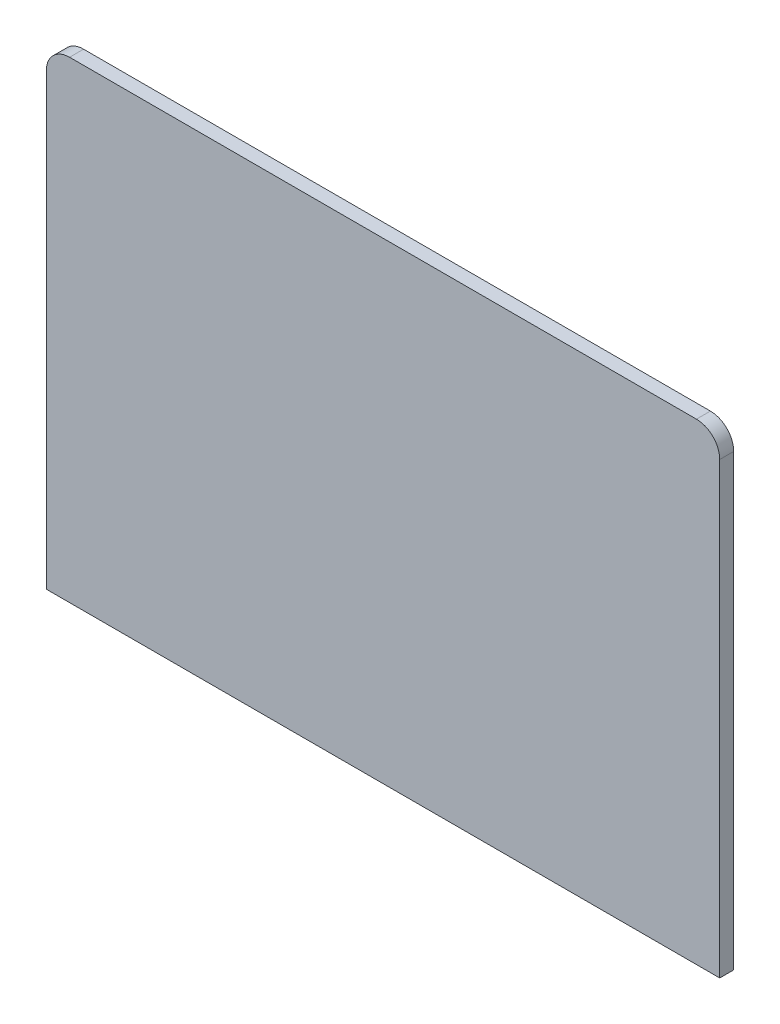
ISO-10303-21;
HEADER;
FILE_DESCRIPTION(('STEP AP214'),'2;1');
FILE_NAME('part.step','',(''),(''),'','','');
FILE_SCHEMA(('AUTOMOTIVE_DESIGN { 1 0 10303 214 1 1 1 1 }'));
ENDSEC;
DATA;
#1=APPLICATION_CONTEXT('core data for automotive mechanical design processes');
#2=APPLICATION_PROTOCOL_DEFINITION('international standard','automotive_design',2000,#1);
#3=PRODUCT_CONTEXT('',#1,'mechanical');
#4=PRODUCT('Part','Part','',(#3));
#5=PRODUCT_RELATED_PRODUCT_CATEGORY('part','',(#4));
#6=PRODUCT_DEFINITION_FORMATION('','',#4);
#7=PRODUCT_DEFINITION_CONTEXT('part definition',#1,'design');
#8=PRODUCT_DEFINITION('design','',#6,#7);
#9=PRODUCT_DEFINITION_SHAPE('','',#8);
#10=(LENGTH_UNIT() NAMED_UNIT(*) SI_UNIT(.MILLI.,.METRE.));
#11=(NAMED_UNIT(*) PLANE_ANGLE_UNIT() SI_UNIT($,.RADIAN.));
#12=(NAMED_UNIT(*) SI_UNIT($,.STERADIAN.) SOLID_ANGLE_UNIT());
#13=UNCERTAINTY_MEASURE_WITH_UNIT(LENGTH_MEASURE(1.E-05),#10,'distance_accuracy_value','');
#14=(GEOMETRIC_REPRESENTATION_CONTEXT(3) GLOBAL_UNCERTAINTY_ASSIGNED_CONTEXT((#13)) GLOBAL_UNIT_ASSIGNED_CONTEXT((#10,
#11,#12)) REPRESENTATION_CONTEXT('',''));
#15=CARTESIAN_POINT('',(0.,0.,0.));
#16=DIRECTION('',(0.,0.,1.));
#17=DIRECTION('',(1.,0.,0.));
#18=AXIS2_PLACEMENT_3D('',#15,#16,#17);
#19=CARTESIAN_POINT('',(0.,0.,3.));
#20=DIRECTION('',(1.,0.,0.));
#21=DIRECTION('',(0.,1.,0.));
#22=AXIS2_PLACEMENT_3D('',#19,#20,#21);
#23=PLANE('',#22);
#24=DIRECTION('',(0.,-1.,0.));
#25=VECTOR('',#24,1.);
#26=CARTESIAN_POINT('',(0.,0.,3.));
#27=LINE('',#26,#25);
#28=CARTESIAN_POINT('',(0.,96.35,3.));
#29=VERTEX_POINT('',#28);
#30=CARTESIAN_POINT('',(0.,0.,3.));
#31=VERTEX_POINT('',#30);
#32=EDGE_CURVE('E86',#29,#31,#27,.T.);
#33=ORIENTED_EDGE('',*,*,#32,.F.);
#34=DIRECTION('',(0.,0.,-1.));
#35=VECTOR('',#34,1.);
#36=CARTESIAN_POINT('',(0.,96.35,3.));
#37=LINE('',#36,#35);
#38=CARTESIAN_POINT('',(0.,96.35,0.));
#39=VERTEX_POINT('',#38);
#40=EDGE_CURVE('E11',#29,#39,#37,.T.);
#41=ORIENTED_EDGE('',*,*,#40,.T.);
#42=DIRECTION('',(0.,-1.,0.));
#43=VECTOR('',#42,1.);
#44=CARTESIAN_POINT('',(0.,0.,0.));
#45=LINE('',#44,#43);
#46=CARTESIAN_POINT('',(0.,0.,0.));
#47=VERTEX_POINT('',#46);
#48=EDGE_CURVE('E105',#39,#47,#45,.T.);
#49=ORIENTED_EDGE('',*,*,#48,.T.);
#50=DIRECTION('',(0.,0.,-1.));
#51=VECTOR('',#50,1.);
#52=CARTESIAN_POINT('',(0.,0.,3.));
#53=LINE('',#52,#51);
#54=EDGE_CURVE('E99',#31,#47,#53,.T.);
#55=ORIENTED_EDGE('',*,*,#54,.F.);
#56=EDGE_LOOP('',(#33,#41,#49,#55));
#57=FACE_BOUND('',#56,.T.);
#58=ADVANCED_FACE('F33',(#57),#23,.F.);
#59=CARTESIAN_POINT('',(0.,0.,3.));
#60=DIRECTION('',(0.,1.,0.));
#61=DIRECTION('',(0.,0.,1.));
#62=AXIS2_PLACEMENT_3D('',#59,#60,#61);
#63=PLANE('',#62);
#64=DIRECTION('',(1.,0.,0.));
#65=VECTOR('',#64,1.);
#66=CARTESIAN_POINT('',(0.,0.,0.));
#67=LINE('',#66,#65);
#68=CARTESIAN_POINT('',(144.5,0.,0.));
#69=VERTEX_POINT('',#68);
#70=EDGE_CURVE('E138',#47,#69,#67,.T.);
#71=ORIENTED_EDGE('',*,*,#70,.T.);
#72=DIRECTION('',(0.,0.,-1.));
#73=VECTOR('',#72,1.);
#74=CARTESIAN_POINT('',(144.5,0.,3.));
#75=LINE('',#74,#73);
#76=CARTESIAN_POINT('',(144.5,0.,3.));
#77=VERTEX_POINT('',#76);
#78=EDGE_CURVE('E101',#77,#69,#75,.T.);
#79=ORIENTED_EDGE('',*,*,#78,.F.);
#80=DIRECTION('',(1.,0.,0.));
#81=VECTOR('',#80,1.);
#82=CARTESIAN_POINT('',(0.,0.,3.));
#83=LINE('',#82,#81);
#84=EDGE_CURVE('E89',#31,#77,#83,.T.);
#85=ORIENTED_EDGE('',*,*,#84,.F.);
#86=ORIENTED_EDGE('',*,*,#54,.T.);
#87=EDGE_LOOP('',(#71,#79,#85,#86));
#88=FACE_BOUND('',#87,.T.);
#89=ADVANCED_FACE('F98',(#88),#63,.F.);
#90=CARTESIAN_POINT('',(144.5,0.,3.));
#91=DIRECTION('',(-1.,0.,0.));
#92=DIRECTION('',(0.,0.,1.));
#93=AXIS2_PLACEMENT_3D('',#90,#91,#92);
#94=PLANE('',#93);
#95=DIRECTION('',(0.,1.,0.));
#96=VECTOR('',#95,1.);
#97=CARTESIAN_POINT('',(144.5,0.,0.));
#98=LINE('',#97,#96);
#99=CARTESIAN_POINT('',(144.5,96.35,0.));
#100=VERTEX_POINT('',#99);
#101=EDGE_CURVE('E136',#69,#100,#98,.T.);
#102=ORIENTED_EDGE('',*,*,#101,.T.);
#103=DIRECTION('',(0.,0.,-1.));
#104=VECTOR('',#103,1.);
#105=CARTESIAN_POINT('',(144.5,96.35,3.));
#106=LINE('',#105,#104);
#107=CARTESIAN_POINT('',(144.5,96.35,3.));
#108=VERTEX_POINT('',#107);
#109=EDGE_CURVE('E56',#100,#108,#106,.F.);
#110=ORIENTED_EDGE('',*,*,#109,.T.);
#111=DIRECTION('',(0.,1.,0.));
#112=VECTOR('',#111,1.);
#113=CARTESIAN_POINT('',(144.5,0.,3.));
#114=LINE('',#113,#112);
#115=EDGE_CURVE('E102',#77,#108,#114,.T.);
#116=ORIENTED_EDGE('',*,*,#115,.F.);
#117=ORIENTED_EDGE('',*,*,#78,.T.);
#118=EDGE_LOOP('',(#102,#110,#116,#117));
#119=FACE_BOUND('',#118,.T.);
#120=ADVANCED_FACE('F137',(#119),#94,.F.);
#121=CARTESIAN_POINT('',(0.,101.35,3.));
#122=DIRECTION('',(0.,-1.,0.));
#123=DIRECTION('',(0.,0.,-1.));
#124=AXIS2_PLACEMENT_3D('',#121,#122,#123);
#125=PLANE('',#124);
#126=DIRECTION('',(-1.,0.,0.));
#127=VECTOR('',#126,1.);
#128=CARTESIAN_POINT('',(0.,101.35,3.));
#129=LINE('',#128,#127);
#130=CARTESIAN_POINT('',(139.5,101.35,3.));
#131=VERTEX_POINT('',#130);
#132=CARTESIAN_POINT('',(4.99999999999997,101.35,3.));
#133=VERTEX_POINT('',#132);
#134=EDGE_CURVE('E111',#131,#133,#129,.T.);
#135=ORIENTED_EDGE('',*,*,#134,.F.);
#136=DIRECTION('',(0.,0.,-1.));
#137=VECTOR('',#136,1.);
#138=CARTESIAN_POINT('',(139.5,101.35,3.));
#139=LINE('',#138,#137);
#140=CARTESIAN_POINT('',(139.5,101.35,0.));
#141=VERTEX_POINT('',#140);
#142=EDGE_CURVE('E109',#131,#141,#139,.T.);
#143=ORIENTED_EDGE('',*,*,#142,.T.);
#144=DIRECTION('',(-1.,0.,0.));
#145=VECTOR('',#144,1.);
#146=CARTESIAN_POINT('',(0.,101.35,0.));
#147=LINE('',#146,#145);
#148=CARTESIAN_POINT('',(4.99999999999997,101.35,0.));
#149=VERTEX_POINT('',#148);
#150=EDGE_CURVE('E94',#141,#149,#147,.T.);
#151=ORIENTED_EDGE('',*,*,#150,.T.);
#152=DIRECTION('',(0.,0.,-1.));
#153=VECTOR('',#152,1.);
#154=CARTESIAN_POINT('',(4.99999999999997,101.35,3.));
#155=LINE('',#154,#153);
#156=EDGE_CURVE('E107',#149,#133,#155,.F.);
#157=ORIENTED_EDGE('',*,*,#156,.T.);
#158=EDGE_LOOP('',(#135,#143,#151,#157));
#159=FACE_BOUND('',#158,.T.);
#160=ADVANCED_FACE('F127',(#159),#125,.F.);
#161=CARTESIAN_POINT('',(0.,0.,3.));
#162=DIRECTION('',(0.,0.,-1.));
#163=DIRECTION('',(-1.,0.,0.));
#164=AXIS2_PLACEMENT_3D('',#161,#162,#163);
#165=PLANE('',#164);
#166=ORIENTED_EDGE('',*,*,#115,.T.);
#167=CARTESIAN_POINT('',(139.5,96.35,3.));
#168=DIRECTION('',(0.,0.,-1.));
#169=DIRECTION('',(-1.,0.,0.));
#170=AXIS2_PLACEMENT_3D('',#167,#168,#169);
#171=CIRCLE('',#170,5.);
#172=EDGE_CURVE('E41',#108,#131,#171,.F.);
#173=ORIENTED_EDGE('',*,*,#172,.T.);
#174=ORIENTED_EDGE('',*,*,#134,.T.);
#175=CARTESIAN_POINT('',(4.99999999999997,96.35,3.));
#176=DIRECTION('',(0.,0.,-1.));
#177=DIRECTION('',(-1.,0.,0.));
#178=AXIS2_PLACEMENT_3D('',#175,#176,#177);
#179=CIRCLE('',#178,5.);
#180=EDGE_CURVE('E48',#133,#29,#179,.F.);
#181=ORIENTED_EDGE('',*,*,#180,.T.);
#182=ORIENTED_EDGE('',*,*,#32,.T.);
#183=ORIENTED_EDGE('',*,*,#84,.T.);
#184=EDGE_LOOP('',(#166,#173,#174,#181,#182,#183));
#185=FACE_BOUND('',#184,.T.);
#186=ADVANCED_FACE('F88',(#185),#165,.F.);
#187=CARTESIAN_POINT('',(0.,0.,0.));
#188=DIRECTION('',(0.,0.,-1.));
#189=DIRECTION('',(-1.,0.,0.));
#190=AXIS2_PLACEMENT_3D('',#187,#188,#189);
#191=PLANE('',#190);
#192=ORIENTED_EDGE('',*,*,#150,.F.);
#193=CARTESIAN_POINT('',(139.5,96.35,0.));
#194=DIRECTION('',(0.,0.,-1.));
#195=DIRECTION('',(-1.,0.,0.));
#196=AXIS2_PLACEMENT_3D('',#193,#194,#195);
#197=CIRCLE('',#196,5.);
#198=EDGE_CURVE('E119',#141,#100,#197,.T.);
#199=ORIENTED_EDGE('',*,*,#198,.T.);
#200=ORIENTED_EDGE('',*,*,#101,.F.);
#201=ORIENTED_EDGE('',*,*,#70,.F.);
#202=ORIENTED_EDGE('',*,*,#48,.F.);
#203=CARTESIAN_POINT('',(4.99999999999997,96.35,0.));
#204=DIRECTION('',(0.,0.,-1.));
#205=DIRECTION('',(-1.,0.,0.));
#206=AXIS2_PLACEMENT_3D('',#203,#204,#205);
#207=CIRCLE('',#206,5.);
#208=EDGE_CURVE('E117',#39,#149,#207,.T.);
#209=ORIENTED_EDGE('',*,*,#208,.T.);
#210=EDGE_LOOP('',(#192,#199,#200,#201,#202,#209));
#211=FACE_BOUND('',#210,.T.);
#212=ADVANCED_FACE('F135',(#211),#191,.T.);
#213=CARTESIAN_POINT('',(139.5,96.35,3.));
#214=DIRECTION('',(0.,0.,-1.));
#215=DIRECTION('',(-1.,0.,0.));
#216=AXIS2_PLACEMENT_3D('',#213,#214,#215);
#217=CYLINDRICAL_SURFACE('',#216,5.);
#218=ORIENTED_EDGE('',*,*,#172,.F.);
#219=ORIENTED_EDGE('',*,*,#109,.F.);
#220=ORIENTED_EDGE('',*,*,#198,.F.);
#221=ORIENTED_EDGE('',*,*,#142,.F.);
#222=EDGE_LOOP('',(#218,#219,#220,#221));
#223=FACE_BOUND('',#222,.T.);
#224=ADVANCED_FACE('F132',(#223),#217,.T.);
#225=CARTESIAN_POINT('',(4.99999999999997,96.35,3.));
#226=DIRECTION('',(0.,0.,-1.));
#227=DIRECTION('',(-1.,0.,0.));
#228=AXIS2_PLACEMENT_3D('',#225,#226,#227);
#229=CYLINDRICAL_SURFACE('',#228,5.);
#230=ORIENTED_EDGE('',*,*,#180,.F.);
#231=ORIENTED_EDGE('',*,*,#156,.F.);
#232=ORIENTED_EDGE('',*,*,#208,.F.);
#233=ORIENTED_EDGE('',*,*,#40,.F.);
#234=EDGE_LOOP('',(#230,#231,#232,#233));
#235=FACE_BOUND('',#234,.T.);
#236=ADVANCED_FACE('F35',(#235),#229,.T.);
#237=CLOSED_SHELL('',(#58,#89,#120,#160,#186,#212,#224,#236));
#238=MANIFOLD_SOLID_BREP('B2',#237);
#239=ADVANCED_BREP_SHAPE_REPRESENTATION('',(#18,#238),#14);
#240=SHAPE_DEFINITION_REPRESENTATION(#9,#239);
ENDSEC;
END-ISO-10303-21;
